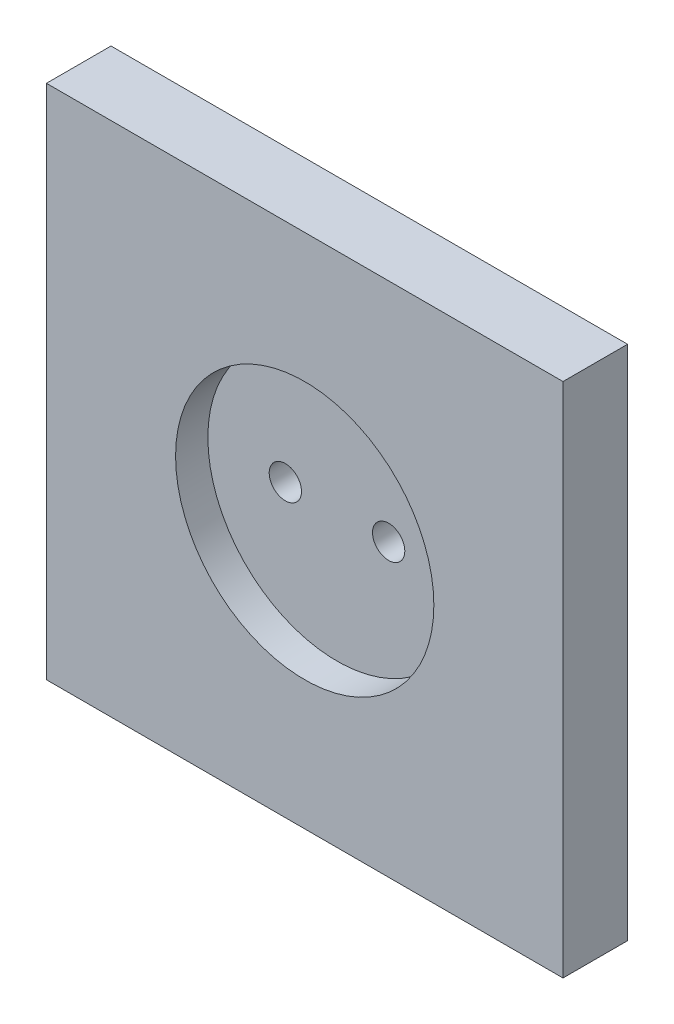
ISO-10303-21;
HEADER;
FILE_DESCRIPTION(('STEP AP214'),'2;1');
FILE_NAME('part.step','',(''),(''),'','','');
FILE_SCHEMA(('AUTOMOTIVE_DESIGN { 1 0 10303 214 1 1 1 1 }'));
ENDSEC;
DATA;
#1=APPLICATION_CONTEXT('core data for automotive mechanical design processes');
#2=APPLICATION_PROTOCOL_DEFINITION('international standard','automotive_design',2000,#1);
#3=PRODUCT_CONTEXT('',#1,'mechanical');
#4=PRODUCT('Part','Part','',(#3));
#5=PRODUCT_RELATED_PRODUCT_CATEGORY('part','',(#4));
#6=PRODUCT_DEFINITION_FORMATION('','',#4);
#7=PRODUCT_DEFINITION_CONTEXT('part definition',#1,'design');
#8=PRODUCT_DEFINITION('design','',#6,#7);
#9=PRODUCT_DEFINITION_SHAPE('','',#8);
#10=(LENGTH_UNIT() NAMED_UNIT(*) SI_UNIT(.MILLI.,.METRE.));
#11=(NAMED_UNIT(*) PLANE_ANGLE_UNIT() SI_UNIT($,.RADIAN.));
#12=(NAMED_UNIT(*) SI_UNIT($,.STERADIAN.) SOLID_ANGLE_UNIT());
#13=UNCERTAINTY_MEASURE_WITH_UNIT(LENGTH_MEASURE(1.E-05),#10,'distance_accuracy_value','');
#14=(GEOMETRIC_REPRESENTATION_CONTEXT(3) GLOBAL_UNCERTAINTY_ASSIGNED_CONTEXT((#13)) GLOBAL_UNIT_ASSIGNED_CONTEXT((#10,
#11,#12)) REPRESENTATION_CONTEXT('',''));
#15=CARTESIAN_POINT('',(0.,0.,0.));
#16=DIRECTION('',(0.,0.,1.));
#17=DIRECTION('',(1.,0.,0.));
#18=AXIS2_PLACEMENT_3D('',#15,#16,#17);
#19=CARTESIAN_POINT('',(0.,0.,10.));
#20=DIRECTION('',(1.,0.,0.));
#21=DIRECTION('',(0.,0.,-1.));
#22=AXIS2_PLACEMENT_3D('',#19,#20,#21);
#23=PLANE('',#22);
#24=DIRECTION('',(0.,-1.,0.));
#25=VECTOR('',#24,1.);
#26=CARTESIAN_POINT('',(0.,0.,0.));
#27=LINE('',#26,#25);
#28=CARTESIAN_POINT('',(0.,80.,0.));
#29=VERTEX_POINT('',#28);
#30=CARTESIAN_POINT('',(0.,0.,0.));
#31=VERTEX_POINT('',#30);
#32=EDGE_CURVE('E107',#29,#31,#27,.T.);
#33=ORIENTED_EDGE('',*,*,#32,.T.);
#34=DIRECTION('',(0.,0.,-1.));
#35=VECTOR('',#34,1.);
#36=CARTESIAN_POINT('',(0.,0.,10.));
#37=LINE('',#36,#35);
#38=CARTESIAN_POINT('',(0.,0.,10.));
#39=VERTEX_POINT('',#38);
#40=EDGE_CURVE('E11',#39,#31,#37,.T.);
#41=ORIENTED_EDGE('',*,*,#40,.F.);
#42=DIRECTION('',(0.,-1.,0.));
#43=VECTOR('',#42,1.);
#44=CARTESIAN_POINT('',(0.,0.,10.));
#45=LINE('',#44,#43);
#46=CARTESIAN_POINT('',(0.,80.,10.));
#47=VERTEX_POINT('',#46);
#48=EDGE_CURVE('E91',#47,#39,#45,.T.);
#49=ORIENTED_EDGE('',*,*,#48,.F.);
#50=DIRECTION('',(0.,0.,-1.));
#51=VECTOR('',#50,1.);
#52=CARTESIAN_POINT('',(0.,80.,10.));
#53=LINE('',#52,#51);
#54=EDGE_CURVE('E103',#47,#29,#53,.T.);
#55=ORIENTED_EDGE('',*,*,#54,.T.);
#56=EDGE_LOOP('',(#33,#41,#49,#55));
#57=FACE_BOUND('',#56,.T.);
#58=ADVANCED_FACE('F39',(#57),#23,.F.);
#59=CARTESIAN_POINT('',(0.,0.,10.));
#60=DIRECTION('',(0.,1.,0.));
#61=DIRECTION('',(0.,0.,1.));
#62=AXIS2_PLACEMENT_3D('',#59,#60,#61);
#63=PLANE('',#62);
#64=DIRECTION('',(1.,0.,0.));
#65=VECTOR('',#64,1.);
#66=CARTESIAN_POINT('',(0.,0.,0.));
#67=LINE('',#66,#65);
#68=CARTESIAN_POINT('',(80.,0.,0.));
#69=VERTEX_POINT('',#68);
#70=EDGE_CURVE('E96',#31,#69,#67,.T.);
#71=ORIENTED_EDGE('',*,*,#70,.T.);
#72=DIRECTION('',(0.,0.,-1.));
#73=VECTOR('',#72,1.);
#74=CARTESIAN_POINT('',(80.,0.,10.));
#75=LINE('',#74,#73);
#76=CARTESIAN_POINT('',(80.,0.,10.));
#77=VERTEX_POINT('',#76);
#78=EDGE_CURVE('E48',#77,#69,#75,.T.);
#79=ORIENTED_EDGE('',*,*,#78,.F.);
#80=DIRECTION('',(1.,0.,0.));
#81=VECTOR('',#80,1.);
#82=CARTESIAN_POINT('',(0.,0.,10.));
#83=LINE('',#82,#81);
#84=EDGE_CURVE('E86',#39,#77,#83,.T.);
#85=ORIENTED_EDGE('',*,*,#84,.F.);
#86=ORIENTED_EDGE('',*,*,#40,.T.);
#87=EDGE_LOOP('',(#71,#79,#85,#86));
#88=FACE_BOUND('',#87,.T.);
#89=ADVANCED_FACE('F95',(#88),#63,.F.);
#90=CARTESIAN_POINT('',(80.,0.,10.));
#91=DIRECTION('',(-1.,0.,0.));
#92=DIRECTION('',(0.,0.,1.));
#93=AXIS2_PLACEMENT_3D('',#90,#91,#92);
#94=PLANE('',#93);
#95=DIRECTION('',(0.,1.,0.));
#96=VECTOR('',#95,1.);
#97=CARTESIAN_POINT('',(80.,0.,0.));
#98=LINE('',#97,#96);
#99=CARTESIAN_POINT('',(80.,80.,0.));
#100=VERTEX_POINT('',#99);
#101=EDGE_CURVE('E73',#69,#100,#98,.T.);
#102=ORIENTED_EDGE('',*,*,#101,.T.);
#103=DIRECTION('',(0.,0.,-1.));
#104=VECTOR('',#103,1.);
#105=CARTESIAN_POINT('',(80.,80.,10.));
#106=LINE('',#105,#104);
#107=CARTESIAN_POINT('',(80.,80.,10.));
#108=VERTEX_POINT('',#107);
#109=EDGE_CURVE('E98',#108,#100,#106,.T.);
#110=ORIENTED_EDGE('',*,*,#109,.F.);
#111=DIRECTION('',(0.,1.,0.));
#112=VECTOR('',#111,1.);
#113=CARTESIAN_POINT('',(80.,0.,10.));
#114=LINE('',#113,#112);
#115=EDGE_CURVE('E89',#77,#108,#114,.T.);
#116=ORIENTED_EDGE('',*,*,#115,.F.);
#117=ORIENTED_EDGE('',*,*,#78,.T.);
#118=EDGE_LOOP('',(#102,#110,#116,#117));
#119=FACE_BOUND('',#118,.T.);
#120=ADVANCED_FACE('F99',(#119),#94,.F.);
#121=CARTESIAN_POINT('',(0.,80.,10.));
#122=DIRECTION('',(0.,-1.,0.));
#123=DIRECTION('',(0.,0.,-1.));
#124=AXIS2_PLACEMENT_3D('',#121,#122,#123);
#125=PLANE('',#124);
#126=DIRECTION('',(-1.,0.,0.));
#127=VECTOR('',#126,1.);
#128=CARTESIAN_POINT('',(0.,80.,0.));
#129=LINE('',#128,#127);
#130=EDGE_CURVE('E79',#100,#29,#129,.T.);
#131=ORIENTED_EDGE('',*,*,#130,.T.);
#132=ORIENTED_EDGE('',*,*,#54,.F.);
#133=DIRECTION('',(-1.,0.,0.));
#134=VECTOR('',#133,1.);
#135=CARTESIAN_POINT('',(0.,80.,10.));
#136=LINE('',#135,#134);
#137=EDGE_CURVE('E56',#108,#47,#136,.T.);
#138=ORIENTED_EDGE('',*,*,#137,.F.);
#139=ORIENTED_EDGE('',*,*,#109,.T.);
#140=EDGE_LOOP('',(#131,#132,#138,#139));
#141=FACE_BOUND('',#140,.T.);
#142=ADVANCED_FACE('F121',(#141),#125,.F.);
#143=CARTESIAN_POINT('',(0.,0.,10.));
#144=DIRECTION('',(0.,0.,-1.));
#145=DIRECTION('',(-1.,0.,0.));
#146=AXIS2_PLACEMENT_3D('',#143,#144,#145);
#147=PLANE('',#146);
#148=CARTESIAN_POINT('',(40.,40.,10.));
#149=DIRECTION('',(0.,0.,1.));
#150=DIRECTION('',(1.,0.,0.));
#151=AXIS2_PLACEMENT_3D('',#148,#149,#150);
#152=CIRCLE('',#151,20.);
#153=CARTESIAN_POINT('',(60.,40.,10.));
#154=VERTEX_POINT('',#153);
#155=EDGE_CURVE('E128',#154,#154,#152,.T.);
#156=ORIENTED_EDGE('',*,*,#155,.F.);
#157=EDGE_LOOP('',(#156));
#158=FACE_BOUND('',#157,.T.);
#159=ORIENTED_EDGE('',*,*,#48,.T.);
#160=ORIENTED_EDGE('',*,*,#84,.T.);
#161=ORIENTED_EDGE('',*,*,#115,.T.);
#162=ORIENTED_EDGE('',*,*,#137,.T.);
#163=EDGE_LOOP('',(#159,#160,#161,#162));
#164=FACE_BOUND('',#163,.T.);
#165=ADVANCED_FACE('F87',(#158,#164),#147,.F.);
#166=CARTESIAN_POINT('',(0.,0.,0.));
#167=DIRECTION('',(0.,0.,-1.));
#168=DIRECTION('',(-1.,0.,0.));
#169=AXIS2_PLACEMENT_3D('',#166,#167,#168);
#170=PLANE('',#169);
#171=CARTESIAN_POINT('',(32.,40.,0.));
#172=DIRECTION('',(0.,0.,1.));
#173=DIRECTION('',(1.,0.,0.));
#174=AXIS2_PLACEMENT_3D('',#171,#172,#173);
#175=CIRCLE('',#174,2.5);
#176=CARTESIAN_POINT('',(34.5,40.,0.));
#177=VERTEX_POINT('',#176);
#178=EDGE_CURVE('E132',#177,#177,#175,.T.);
#179=ORIENTED_EDGE('',*,*,#178,.T.);
#180=EDGE_LOOP('',(#179));
#181=FACE_BOUND('',#180,.T.);
#182=CARTESIAN_POINT('',(48.,40.,0.));
#183=DIRECTION('',(0.,0.,1.));
#184=DIRECTION('',(1.,0.,0.));
#185=AXIS2_PLACEMENT_3D('',#182,#183,#184);
#186=CIRCLE('',#185,2.5);
#187=CARTESIAN_POINT('',(50.5,40.,0.));
#188=VERTEX_POINT('',#187);
#189=EDGE_CURVE('E140',#188,#188,#186,.T.);
#190=ORIENTED_EDGE('',*,*,#189,.T.);
#191=EDGE_LOOP('',(#190));
#192=FACE_BOUND('',#191,.T.);
#193=ORIENTED_EDGE('',*,*,#32,.F.);
#194=ORIENTED_EDGE('',*,*,#130,.F.);
#195=ORIENTED_EDGE('',*,*,#101,.F.);
#196=ORIENTED_EDGE('',*,*,#70,.F.);
#197=EDGE_LOOP('',(#193,#194,#195,#196));
#198=FACE_BOUND('',#197,.T.);
#199=ADVANCED_FACE('F124',(#181,#192,#198),#170,.T.);
#200=CARTESIAN_POINT('',(40.,40.,5.));
#201=DIRECTION('',(0.,0.,1.));
#202=DIRECTION('',(1.,0.,0.));
#203=AXIS2_PLACEMENT_3D('',#200,#201,#202);
#204=CYLINDRICAL_SURFACE('',#203,20.);
#205=CARTESIAN_POINT('',(40.,40.,5.));
#206=DIRECTION('',(0.,0.,1.));
#207=DIRECTION('',(1.,0.,0.));
#208=AXIS2_PLACEMENT_3D('',#205,#206,#207);
#209=CIRCLE('',#208,20.);
#210=CARTESIAN_POINT('',(60.,40.,5.));
#211=VERTEX_POINT('',#210);
#212=EDGE_CURVE('E111',#211,#211,#209,.T.);
#213=ORIENTED_EDGE('',*,*,#212,.F.);
#214=EDGE_LOOP('',(#213));
#215=FACE_BOUND('',#214,.T.);
#216=ORIENTED_EDGE('',*,*,#155,.T.);
#217=EDGE_LOOP('',(#216));
#218=FACE_BOUND('',#217,.T.);
#219=ADVANCED_FACE('F164',(#215,#218),#204,.F.);
#220=CARTESIAN_POINT('',(40.,40.,5.));
#221=DIRECTION('',(0.,0.,1.));
#222=DIRECTION('',(1.,0.,0.));
#223=AXIS2_PLACEMENT_3D('',#220,#221,#222);
#224=PLANE('',#223);
#225=CARTESIAN_POINT('',(32.,40.,5.));
#226=DIRECTION('',(0.,0.,1.));
#227=DIRECTION('',(1.,0.,0.));
#228=AXIS2_PLACEMENT_3D('',#225,#226,#227);
#229=CIRCLE('',#228,2.5);
#230=CARTESIAN_POINT('',(34.5,40.,5.));
#231=VERTEX_POINT('',#230);
#232=EDGE_CURVE('E144',#231,#231,#229,.T.);
#233=ORIENTED_EDGE('',*,*,#232,.F.);
#234=EDGE_LOOP('',(#233));
#235=FACE_BOUND('',#234,.T.);
#236=CARTESIAN_POINT('',(48.,40.,5.));
#237=DIRECTION('',(0.,0.,1.));
#238=DIRECTION('',(1.,0.,0.));
#239=AXIS2_PLACEMENT_3D('',#236,#237,#238);
#240=CIRCLE('',#239,2.5);
#241=CARTESIAN_POINT('',(50.5,40.,5.));
#242=VERTEX_POINT('',#241);
#243=EDGE_CURVE('E136',#242,#242,#240,.T.);
#244=ORIENTED_EDGE('',*,*,#243,.F.);
#245=EDGE_LOOP('',(#244));
#246=FACE_BOUND('',#245,.T.);
#247=ORIENTED_EDGE('',*,*,#212,.T.);
#248=EDGE_LOOP('',(#247));
#249=FACE_BOUND('',#248,.T.);
#250=ADVANCED_FACE('F161',(#235,#246,#249),#224,.T.);
#251=CARTESIAN_POINT('',(48.,40.,0.));
#252=DIRECTION('',(0.,0.,1.));
#253=DIRECTION('',(1.,0.,0.));
#254=AXIS2_PLACEMENT_3D('',#251,#252,#253);
#255=CYLINDRICAL_SURFACE('',#254,2.5);
#256=ORIENTED_EDGE('',*,*,#189,.F.);
#257=EDGE_LOOP('',(#256));
#258=FACE_BOUND('',#257,.T.);
#259=ORIENTED_EDGE('',*,*,#243,.T.);
#260=EDGE_LOOP('',(#259));
#261=FACE_BOUND('',#260,.T.);
#262=ADVANCED_FACE('F157',(#258,#261),#255,.F.);
#263=CARTESIAN_POINT('',(32.,40.,0.));
#264=DIRECTION('',(0.,0.,1.));
#265=DIRECTION('',(1.,0.,0.));
#266=AXIS2_PLACEMENT_3D('',#263,#264,#265);
#267=CYLINDRICAL_SURFACE('',#266,2.5);
#268=ORIENTED_EDGE('',*,*,#178,.F.);
#269=EDGE_LOOP('',(#268));
#270=FACE_BOUND('',#269,.T.);
#271=ORIENTED_EDGE('',*,*,#232,.T.);
#272=EDGE_LOOP('',(#271));
#273=FACE_BOUND('',#272,.T.);
#274=ADVANCED_FACE('F154',(#270,#273),#267,.F.);
#275=CLOSED_SHELL('',(#58,#89,#120,#142,#165,#199,#219,#250,#262,#274));
#276=MANIFOLD_SOLID_BREP('B2',#275);
#277=ADVANCED_BREP_SHAPE_REPRESENTATION('',(#18,#276),#14);
#278=SHAPE_DEFINITION_REPRESENTATION(#9,#277);
ENDSEC;
END-ISO-10303-21;
